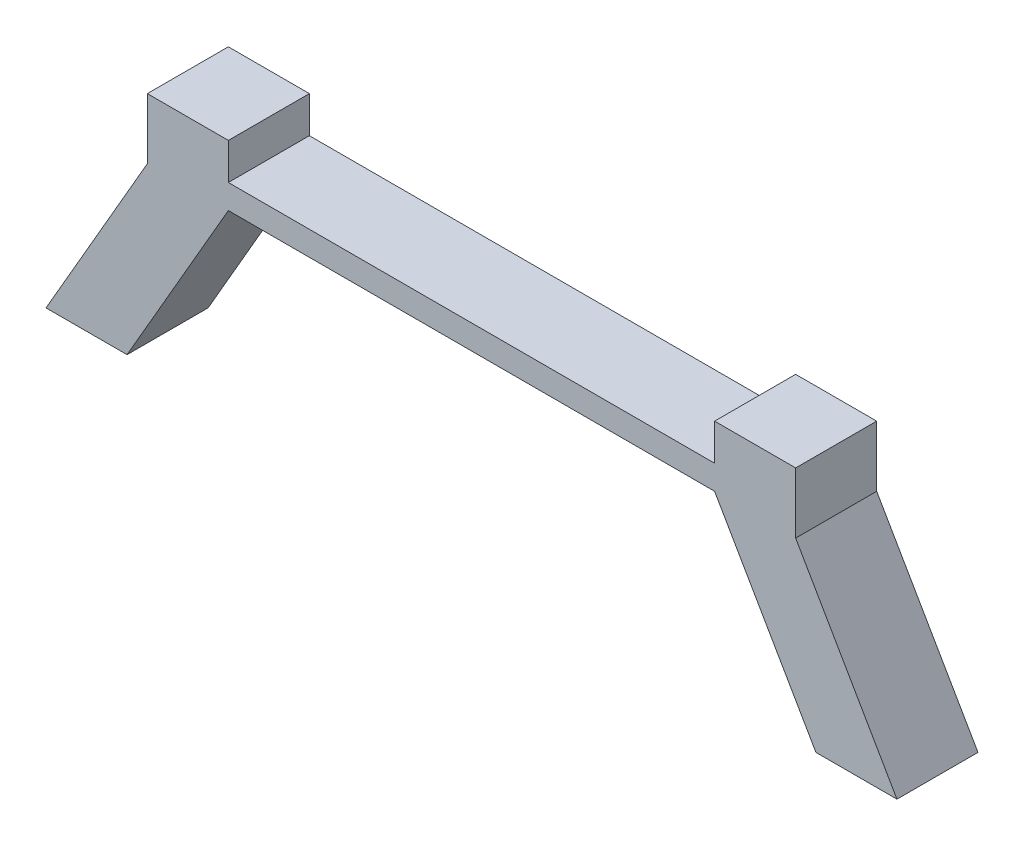
ISO-10303-21;
HEADER;
FILE_DESCRIPTION(('STEP AP214'),'2;1');
FILE_NAME('part.step','',(''),(''),'','','');
FILE_SCHEMA(('AUTOMOTIVE_DESIGN { 1 0 10303 214 1 1 1 1 }'));
ENDSEC;
DATA;
#1=APPLICATION_CONTEXT('core data for automotive mechanical design processes');
#2=APPLICATION_PROTOCOL_DEFINITION('international standard','automotive_design',2000,#1);
#3=PRODUCT_CONTEXT('',#1,'mechanical');
#4=PRODUCT('Part','Part','',(#3));
#5=PRODUCT_RELATED_PRODUCT_CATEGORY('part','',(#4));
#6=PRODUCT_DEFINITION_FORMATION('','',#4);
#7=PRODUCT_DEFINITION_CONTEXT('part definition',#1,'design');
#8=PRODUCT_DEFINITION('design','',#6,#7);
#9=PRODUCT_DEFINITION_SHAPE('','',#8);
#10=(LENGTH_UNIT() NAMED_UNIT(*) SI_UNIT(.MILLI.,.METRE.));
#11=(NAMED_UNIT(*) PLANE_ANGLE_UNIT() SI_UNIT($,.RADIAN.));
#12=(NAMED_UNIT(*) SI_UNIT($,.STERADIAN.) SOLID_ANGLE_UNIT());
#13=UNCERTAINTY_MEASURE_WITH_UNIT(LENGTH_MEASURE(1.E-05),#10,'distance_accuracy_value','');
#14=(GEOMETRIC_REPRESENTATION_CONTEXT(3) GLOBAL_UNCERTAINTY_ASSIGNED_CONTEXT((#13)) GLOBAL_UNIT_ASSIGNED_CONTEXT((#10,
#11,#12)) REPRESENTATION_CONTEXT('',''));
#15=CARTESIAN_POINT('',(0.,0.,0.));
#16=DIRECTION('',(0.,0.,1.));
#17=DIRECTION('',(1.,0.,0.));
#18=AXIS2_PLACEMENT_3D('',#15,#16,#17);
#19=CARTESIAN_POINT('',(0.,0.,0.));
#20=DIRECTION('',(0.,1.,0.));
#21=DIRECTION('',(0.,0.,1.));
#22=AXIS2_PLACEMENT_3D('',#19,#20,#21);
#23=PLANE('',#22);
#24=DIRECTION('',(0.,0.,1.));
#25=VECTOR('',#24,1.);
#26=CARTESIAN_POINT('',(19.9999999999999,0.,-82.4499799839841));
#27=LINE('',#26,#25);
#28=CARTESIAN_POINT('',(19.9999999999999,0.,-20.));
#29=VERTEX_POINT('',#28);
#30=CARTESIAN_POINT('',(19.9999999999999,0.,0.));
#31=VERTEX_POINT('',#30);
#32=EDGE_CURVE('E92',#29,#31,#27,.T.);
#33=ORIENTED_EDGE('',*,*,#32,.F.);
#34=DIRECTION('',(1.,0.,0.));
#35=VECTOR('',#34,1.);
#36=CARTESIAN_POINT('',(0.,0.,-20.));
#37=LINE('',#36,#35);
#38=CARTESIAN_POINT('',(140.,2.78856798763272E-13,-20.));
#39=VERTEX_POINT('',#38);
#40=EDGE_CURVE('E266',#29,#39,#37,.T.);
#41=ORIENTED_EDGE('',*,*,#40,.T.);
#42=DIRECTION('',(0.,0.,1.));
#43=VECTOR('',#42,1.);
#44=CARTESIAN_POINT('',(140.,2.78856798763272E-13,-82.4499799839841));
#45=LINE('',#44,#43);
#46=CARTESIAN_POINT('',(140.,0.,0.));
#47=VERTEX_POINT('',#46);
#48=EDGE_CURVE('E222',#39,#47,#45,.T.);
#49=ORIENTED_EDGE('',*,*,#48,.T.);
#50=DIRECTION('',(1.,0.,0.));
#51=VECTOR('',#50,1.);
#52=CARTESIAN_POINT('',(0.,0.,0.));
#53=LINE('',#52,#51);
#54=EDGE_CURVE('E308',#31,#47,#53,.T.);
#55=ORIENTED_EDGE('',*,*,#54,.F.);
#56=EDGE_LOOP('',(#33,#41,#49,#55));
#57=FACE_BOUND('',#56,.T.);
#58=ADVANCED_FACE('F68',(#57),#23,.F.);
#59=CARTESIAN_POINT('',(0.,15.,0.));
#60=DIRECTION('',(0.,1.,0.));
#61=DIRECTION('',(0.,0.,1.));
#62=AXIS2_PLACEMENT_3D('',#59,#60,#61);
#63=PLANE('',#62);
#64=DIRECTION('',(1.,0.,0.));
#65=VECTOR('',#64,1.);
#66=CARTESIAN_POINT('',(0.,15.,0.));
#67=LINE('',#66,#65);
#68=CARTESIAN_POINT('',(0.,15.,0.));
#69=VERTEX_POINT('',#68);
#70=CARTESIAN_POINT('',(20.,15.,0.));
#71=VERTEX_POINT('',#70);
#72=EDGE_CURVE('E295',#69,#71,#67,.T.);
#73=ORIENTED_EDGE('',*,*,#72,.T.);
#74=DIRECTION('',(0.,0.,-1.));
#75=VECTOR('',#74,1.);
#76=CARTESIAN_POINT('',(20.,15.,0.));
#77=LINE('',#76,#75);
#78=CARTESIAN_POINT('',(20.,15.,-20.));
#79=VERTEX_POINT('',#78);
#80=EDGE_CURVE('E253',#71,#79,#77,.T.);
#81=ORIENTED_EDGE('',*,*,#80,.T.);
#82=DIRECTION('',(1.,0.,0.));
#83=VECTOR('',#82,1.);
#84=CARTESIAN_POINT('',(0.,15.,-20.));
#85=LINE('',#84,#83);
#86=CARTESIAN_POINT('',(0.,15.,-20.));
#87=VERTEX_POINT('',#86);
#88=EDGE_CURVE('E285',#87,#79,#85,.T.);
#89=ORIENTED_EDGE('',*,*,#88,.F.);
#90=DIRECTION('',(0.,0.,-1.));
#91=VECTOR('',#90,1.);
#92=CARTESIAN_POINT('',(0.,15.,0.));
#93=LINE('',#92,#91);
#94=EDGE_CURVE('E296',#69,#87,#93,.T.);
#95=ORIENTED_EDGE('',*,*,#94,.F.);
#96=EDGE_LOOP('',(#73,#81,#89,#95));
#97=FACE_BOUND('',#96,.T.);
#98=ADVANCED_FACE('F337',(#97),#63,.T.);
#99=CARTESIAN_POINT('',(0.,15.,-20.));
#100=DIRECTION('',(0.,0.,-1.));
#101=DIRECTION('',(-1.,0.,0.));
#102=AXIS2_PLACEMENT_3D('',#99,#100,#101);
#103=PLANE('',#102);
#104=DIRECTION('',(-1.,0.,0.));
#105=VECTOR('',#104,1.);
#106=CARTESIAN_POINT('',(0.,6.,-20.));
#107=LINE('',#106,#105);
#108=CARTESIAN_POINT('',(140.,6.,-20.));
#109=VERTEX_POINT('',#108);
#110=CARTESIAN_POINT('',(20.,6.,-20.));
#111=VERTEX_POINT('',#110);
#112=EDGE_CURVE('E255',#109,#111,#107,.T.);
#113=ORIENTED_EDGE('',*,*,#112,.F.);
#114=DIRECTION('',(0.,1.,0.));
#115=VECTOR('',#114,1.);
#116=CARTESIAN_POINT('',(140.,6.,-20.));
#117=LINE('',#116,#115);
#118=CARTESIAN_POINT('',(140.,15.,-20.));
#119=VERTEX_POINT('',#118);
#120=EDGE_CURVE('E273',#109,#119,#117,.T.);
#121=ORIENTED_EDGE('',*,*,#120,.T.);
#122=CARTESIAN_POINT('',(160.,15.,-20.));
#123=VERTEX_POINT('',#122);
#124=EDGE_CURVE('E286',#119,#123,#85,.T.);
#125=ORIENTED_EDGE('',*,*,#124,.T.);
#126=DIRECTION('',(0.,-1.,0.));
#127=VECTOR('',#126,1.);
#128=CARTESIAN_POINT('',(160.,15.,-20.));
#129=LINE('',#128,#127);
#130=CARTESIAN_POINT('',(160.,3.70074341541719E-13,-20.));
#131=VERTEX_POINT('',#130);
#132=EDGE_CURVE('E71',#123,#131,#129,.T.);
#133=ORIENTED_EDGE('',*,*,#132,.T.);
#134=DIRECTION('',(-0.500000000000004,0.866025403784437,0.));
#135=VECTOR('',#134,1.);
#136=CARTESIAN_POINT('',(160.,3.69487969562839E-13,-20.));
#137=LINE('',#136,#135);
#138=CARTESIAN_POINT('',(185.,-43.3012701892215,-20.));
#139=VERTEX_POINT('',#138);
#140=EDGE_CURVE('E221',#139,#131,#137,.T.);
#141=ORIENTED_EDGE('',*,*,#140,.F.);
#142=DIRECTION('',(1.,0.,0.));
#143=VECTOR('',#142,1.);
#144=CARTESIAN_POINT('',(185.,-43.3012701892215,-20.));
#145=LINE('',#144,#143);
#146=CARTESIAN_POINT('',(165.,-43.3012701892216,-20.));
#147=VERTEX_POINT('',#146);
#148=EDGE_CURVE('E219',#147,#139,#145,.T.);
#149=ORIENTED_EDGE('',*,*,#148,.F.);
#150=DIRECTION('',(0.500000000000002,-0.866025403784438,0.));
#151=VECTOR('',#150,1.);
#152=CARTESIAN_POINT('',(165.,-43.3012701892216,-20.));
#153=LINE('',#152,#151);
#154=EDGE_CURVE('E223',#39,#147,#153,.T.);
#155=ORIENTED_EDGE('',*,*,#154,.F.);
#156=ORIENTED_EDGE('',*,*,#40,.F.);
#157=DIRECTION('',(0.499999999999998,0.86602540378444,0.));
#158=VECTOR('',#157,1.);
#159=CARTESIAN_POINT('',(-5.,-43.301270189222,-20.));
#160=LINE('',#159,#158);
#161=CARTESIAN_POINT('',(-5.,-43.301270189222,-20.));
#162=VERTEX_POINT('',#161);
#163=EDGE_CURVE('E182',#162,#29,#160,.T.);
#164=ORIENTED_EDGE('',*,*,#163,.F.);
#165=DIRECTION('',(1.,0.,0.));
#166=VECTOR('',#165,1.);
#167=CARTESIAN_POINT('',(-25.,-43.301270189222,-20.));
#168=LINE('',#167,#166);
#169=CARTESIAN_POINT('',(-25.,-43.301270189222,-20.));
#170=VERTEX_POINT('',#169);
#171=EDGE_CURVE('E173',#170,#162,#168,.T.);
#172=ORIENTED_EDGE('',*,*,#171,.F.);
#173=DIRECTION('',(-0.5,-0.866025403784439,0.));
#174=VECTOR('',#173,1.);
#175=CARTESIAN_POINT('',(0.,0.,-20.));
#176=LINE('',#175,#174);
#177=CARTESIAN_POINT('',(0.,0.,-20.));
#178=VERTEX_POINT('',#177);
#179=EDGE_CURVE('E180',#178,#170,#176,.T.);
#180=ORIENTED_EDGE('',*,*,#179,.F.);
#181=DIRECTION('',(0.,-1.,0.));
#182=VECTOR('',#181,1.);
#183=CARTESIAN_POINT('',(0.,15.,-20.));
#184=LINE('',#183,#182);
#185=EDGE_CURVE('E12',#87,#178,#184,.T.);
#186=ORIENTED_EDGE('',*,*,#185,.F.);
#187=ORIENTED_EDGE('',*,*,#88,.T.);
#188=DIRECTION('',(0.,1.,0.));
#189=VECTOR('',#188,1.);
#190=CARTESIAN_POINT('',(20.,6.,-20.));
#191=LINE('',#190,#189);
#192=EDGE_CURVE('E263',#111,#79,#191,.T.);
#193=ORIENTED_EDGE('',*,*,#192,.F.);
#194=EDGE_LOOP('',(#113,#121,#125,#133,#141,#149,#155,#156,#164,#172,#180,#186,#187,#193));
#195=FACE_BOUND('',#194,.T.);
#196=ADVANCED_FACE('F72',(#195),#103,.T.);
#197=CARTESIAN_POINT('',(0.,15.,0.));
#198=DIRECTION('',(-1.,0.,0.));
#199=DIRECTION('',(0.,0.,1.));
#200=AXIS2_PLACEMENT_3D('',#197,#198,#199);
#201=PLANE('',#200);
#202=DIRECTION('',(0.,0.,-1.));
#203=VECTOR('',#202,1.);
#204=CARTESIAN_POINT('',(0.,0.,0.));
#205=LINE('',#204,#203);
#206=CARTESIAN_POINT('',(0.,0.,0.));
#207=VERTEX_POINT('',#206);
#208=EDGE_CURVE('E200',#207,#178,#205,.T.);
#209=ORIENTED_EDGE('',*,*,#208,.F.);
#210=DIRECTION('',(0.,-1.,0.));
#211=VECTOR('',#210,1.);
#212=CARTESIAN_POINT('',(0.,15.,0.));
#213=LINE('',#212,#211);
#214=EDGE_CURVE('E78',#69,#207,#213,.T.);
#215=ORIENTED_EDGE('',*,*,#214,.F.);
#216=ORIENTED_EDGE('',*,*,#94,.T.);
#217=ORIENTED_EDGE('',*,*,#185,.T.);
#218=EDGE_LOOP('',(#209,#215,#216,#217));
#219=FACE_BOUND('',#218,.T.);
#220=ADVANCED_FACE('F348',(#219),#201,.T.);
#221=CARTESIAN_POINT('',(0.,15.,0.));
#222=DIRECTION('',(0.,0.,-1.));
#223=DIRECTION('',(-1.,0.,0.));
#224=AXIS2_PLACEMENT_3D('',#221,#222,#223);
#225=PLANE('',#224);
#226=DIRECTION('',(1.,0.,0.));
#227=VECTOR('',#226,1.);
#228=CARTESIAN_POINT('',(0.,6.,0.));
#229=LINE('',#228,#227);
#230=CARTESIAN_POINT('',(20.,6.,0.));
#231=VERTEX_POINT('',#230);
#232=CARTESIAN_POINT('',(140.,6.,0.));
#233=VERTEX_POINT('',#232);
#234=EDGE_CURVE('E247',#231,#233,#229,.T.);
#235=ORIENTED_EDGE('',*,*,#234,.F.);
#236=DIRECTION('',(0.,1.,0.));
#237=VECTOR('',#236,1.);
#238=CARTESIAN_POINT('',(20.,6.,0.));
#239=LINE('',#238,#237);
#240=EDGE_CURVE('E256',#231,#71,#239,.T.);
#241=ORIENTED_EDGE('',*,*,#240,.T.);
#242=ORIENTED_EDGE('',*,*,#72,.F.);
#243=ORIENTED_EDGE('',*,*,#214,.T.);
#244=DIRECTION('',(-0.499999999999999,-0.866025403784439,0.));
#245=VECTOR('',#244,1.);
#246=CARTESIAN_POINT('',(0.,0.,0.));
#247=LINE('',#246,#245);
#248=CARTESIAN_POINT('',(-25.,-43.301270189222,0.));
#249=VERTEX_POINT('',#248);
#250=EDGE_CURVE('E208',#207,#249,#247,.T.);
#251=ORIENTED_EDGE('',*,*,#250,.T.);
#252=DIRECTION('',(1.,0.,0.));
#253=VECTOR('',#252,1.);
#254=CARTESIAN_POINT('',(-25.,-43.301270189222,0.));
#255=LINE('',#254,#253);
#256=CARTESIAN_POINT('',(-5.,-43.301270189222,0.));
#257=VERTEX_POINT('',#256);
#258=EDGE_CURVE('E194',#249,#257,#255,.T.);
#259=ORIENTED_EDGE('',*,*,#258,.T.);
#260=DIRECTION('',(0.499999999999998,0.86602540378444,0.));
#261=VECTOR('',#260,1.);
#262=CARTESIAN_POINT('',(-5.,-43.301270189222,0.));
#263=LINE('',#262,#261);
#264=EDGE_CURVE('E203',#257,#31,#263,.T.);
#265=ORIENTED_EDGE('',*,*,#264,.T.);
#266=ORIENTED_EDGE('',*,*,#54,.T.);
#267=DIRECTION('',(0.500000000000002,-0.866025403784437,0.));
#268=VECTOR('',#267,1.);
#269=CARTESIAN_POINT('',(165.,-43.3012701892216,0.));
#270=LINE('',#269,#268);
#271=CARTESIAN_POINT('',(165.,-43.3012701892216,0.));
#272=VERTEX_POINT('',#271);
#273=EDGE_CURVE('E87',#47,#272,#270,.T.);
#274=ORIENTED_EDGE('',*,*,#273,.T.);
#275=DIRECTION('',(1.,0.,0.));
#276=VECTOR('',#275,1.);
#277=CARTESIAN_POINT('',(185.,-43.3012701892215,0.));
#278=LINE('',#277,#276);
#279=CARTESIAN_POINT('',(185.,-43.3012701892215,0.));
#280=VERTEX_POINT('',#279);
#281=EDGE_CURVE('E240',#272,#280,#278,.T.);
#282=ORIENTED_EDGE('',*,*,#281,.T.);
#283=DIRECTION('',(-0.500000000000004,0.866025403784437,0.));
#284=VECTOR('',#283,1.);
#285=CARTESIAN_POINT('',(160.,3.70074341541719E-13,0.));
#286=LINE('',#285,#284);
#287=CARTESIAN_POINT('',(160.,3.70074341541719E-13,0.));
#288=VERTEX_POINT('',#287);
#289=EDGE_CURVE('E241',#280,#288,#286,.T.);
#290=ORIENTED_EDGE('',*,*,#289,.T.);
#291=DIRECTION('',(0.,-1.,0.));
#292=VECTOR('',#291,1.);
#293=CARTESIAN_POINT('',(160.,15.,0.));
#294=LINE('',#293,#292);
#295=CARTESIAN_POINT('',(160.,15.,0.));
#296=VERTEX_POINT('',#295);
#297=EDGE_CURVE('E311',#296,#288,#294,.T.);
#298=ORIENTED_EDGE('',*,*,#297,.F.);
#299=CARTESIAN_POINT('',(140.,15.,0.));
#300=VERTEX_POINT('',#299);
#301=EDGE_CURVE('E292',#300,#296,#67,.T.);
#302=ORIENTED_EDGE('',*,*,#301,.F.);
#303=DIRECTION('',(0.,1.,0.));
#304=VECTOR('',#303,1.);
#305=CARTESIAN_POINT('',(140.,6.,0.));
#306=LINE('',#305,#304);
#307=EDGE_CURVE('E265',#233,#300,#306,.T.);
#308=ORIENTED_EDGE('',*,*,#307,.F.);
#309=EDGE_LOOP('',(#235,#241,#242,#243,#251,#259,#265,#266,#274,#282,#290,#298,#302,#308));
#310=FACE_BOUND('',#309,.T.);
#311=ADVANCED_FACE('F329',(#310),#225,.F.);
#312=CARTESIAN_POINT('',(160.,15.,0.));
#313=DIRECTION('',(-1.,0.,0.));
#314=DIRECTION('',(0.,0.,1.));
#315=AXIS2_PLACEMENT_3D('',#312,#313,#314);
#316=PLANE('',#315);
#317=DIRECTION('',(0.,0.,-1.));
#318=VECTOR('',#317,1.);
#319=CARTESIAN_POINT('',(160.,0.,0.));
#320=LINE('',#319,#318);
#321=EDGE_CURVE('E301',#288,#131,#320,.T.);
#322=ORIENTED_EDGE('',*,*,#321,.T.);
#323=ORIENTED_EDGE('',*,*,#132,.F.);
#324=DIRECTION('',(0.,0.,-1.));
#325=VECTOR('',#324,1.);
#326=CARTESIAN_POINT('',(160.,15.,0.));
#327=LINE('',#326,#325);
#328=EDGE_CURVE('E289',#296,#123,#327,.T.);
#329=ORIENTED_EDGE('',*,*,#328,.F.);
#330=ORIENTED_EDGE('',*,*,#297,.T.);
#331=EDGE_LOOP('',(#322,#323,#329,#330));
#332=FACE_BOUND('',#331,.T.);
#333=ADVANCED_FACE('F323',(#332),#316,.F.);
#334=DIRECTION('',(0.,0.,-1.));
#335=VECTOR('',#334,1.);
#336=CARTESIAN_POINT('',(140.,15.,0.));
#337=LINE('',#336,#335);
#338=EDGE_CURVE('E212',#300,#119,#337,.T.);
#339=ORIENTED_EDGE('',*,*,#338,.F.);
#340=ORIENTED_EDGE('',*,*,#301,.T.);
#341=ORIENTED_EDGE('',*,*,#328,.T.);
#342=ORIENTED_EDGE('',*,*,#124,.F.);
#343=EDGE_LOOP('',(#339,#340,#341,#342));
#344=FACE_BOUND('',#343,.T.);
#345=ADVANCED_FACE('F350',(#344),#63,.T.);
#346=CARTESIAN_POINT('',(20.,6.,0.));
#347=DIRECTION('',(1.,0.,0.));
#348=DIRECTION('',(0.,0.,-1.));
#349=AXIS2_PLACEMENT_3D('',#346,#347,#348);
#350=PLANE('',#349);
#351=ORIENTED_EDGE('',*,*,#80,.F.);
#352=ORIENTED_EDGE('',*,*,#240,.F.);
#353=DIRECTION('',(0.,0.,-1.));
#354=VECTOR('',#353,1.);
#355=CARTESIAN_POINT('',(20.,6.,0.));
#356=LINE('',#355,#354);
#357=EDGE_CURVE('E246',#231,#111,#356,.T.);
#358=ORIENTED_EDGE('',*,*,#357,.T.);
#359=ORIENTED_EDGE('',*,*,#192,.T.);
#360=EDGE_LOOP('',(#351,#352,#358,#359));
#361=FACE_BOUND('',#360,.T.);
#362=ADVANCED_FACE('F357',(#361),#350,.T.);
#363=CARTESIAN_POINT('',(0.,6.,0.));
#364=DIRECTION('',(0.,1.,0.));
#365=DIRECTION('',(0.,0.,1.));
#366=AXIS2_PLACEMENT_3D('',#363,#364,#365);
#367=PLANE('',#366);
#368=ORIENTED_EDGE('',*,*,#357,.F.);
#369=ORIENTED_EDGE('',*,*,#234,.T.);
#370=DIRECTION('',(0.,0.,-1.));
#371=VECTOR('',#370,1.);
#372=CARTESIAN_POINT('',(140.,6.,0.));
#373=LINE('',#372,#371);
#374=EDGE_CURVE('E269',#233,#109,#373,.T.);
#375=ORIENTED_EDGE('',*,*,#374,.T.);
#376=ORIENTED_EDGE('',*,*,#112,.T.);
#377=EDGE_LOOP('',(#368,#369,#375,#376));
#378=FACE_BOUND('',#377,.T.);
#379=ADVANCED_FACE('F364',(#378),#367,.T.);
#380=CARTESIAN_POINT('',(140.,6.,0.));
#381=DIRECTION('',(1.,0.,0.));
#382=DIRECTION('',(0.,0.,-1.));
#383=AXIS2_PLACEMENT_3D('',#380,#381,#382);
#384=PLANE('',#383);
#385=ORIENTED_EDGE('',*,*,#338,.T.);
#386=ORIENTED_EDGE('',*,*,#120,.F.);
#387=ORIENTED_EDGE('',*,*,#374,.F.);
#388=ORIENTED_EDGE('',*,*,#307,.T.);
#389=EDGE_LOOP('',(#385,#386,#387,#388));
#390=FACE_BOUND('',#389,.T.);
#391=ADVANCED_FACE('F372',(#390),#384,.F.);
#392=CARTESIAN_POINT('',(160.,3.70074341541719E-13,-82.4499799839841));
#393=DIRECTION('',(0.866025403784437,0.500000000000004,0.));
#394=DIRECTION('',(-0.500000000000004,0.866025403784437,0.));
#395=AXIS2_PLACEMENT_3D('',#392,#393,#394);
#396=PLANE('',#395);
#397=DIRECTION('',(0.,0.,1.));
#398=VECTOR('',#397,1.);
#399=CARTESIAN_POINT('',(185.,-43.3012701892215,-82.4499799839841));
#400=LINE('',#399,#398);
#401=EDGE_CURVE('E220',#139,#280,#400,.T.);
#402=ORIENTED_EDGE('',*,*,#401,.F.);
#403=ORIENTED_EDGE('',*,*,#140,.T.);
#404=ORIENTED_EDGE('',*,*,#321,.F.);
#405=ORIENTED_EDGE('',*,*,#289,.F.);
#406=EDGE_LOOP('',(#402,#403,#404,#405));
#407=FACE_BOUND('',#406,.T.);
#408=ADVANCED_FACE('F330',(#407),#396,.T.);
#409=CARTESIAN_POINT('',(165.,-43.3012701892216,-82.4499799839841));
#410=DIRECTION('',(-0.866025403784437,-0.500000000000002,0.));
#411=DIRECTION('',(0.500000000000002,-0.866025403784438,0.));
#412=AXIS2_PLACEMENT_3D('',#409,#410,#411);
#413=PLANE('',#412);
#414=ORIENTED_EDGE('',*,*,#48,.F.);
#415=ORIENTED_EDGE('',*,*,#154,.T.);
#416=DIRECTION('',(0.,0.,1.));
#417=VECTOR('',#416,1.);
#418=CARTESIAN_POINT('',(165.,-43.3012701892216,-82.4499799839841));
#419=LINE('',#418,#417);
#420=EDGE_CURVE('E226',#147,#272,#419,.T.);
#421=ORIENTED_EDGE('',*,*,#420,.T.);
#422=ORIENTED_EDGE('',*,*,#273,.F.);
#423=EDGE_LOOP('',(#414,#415,#421,#422));
#424=FACE_BOUND('',#423,.T.);
#425=ADVANCED_FACE('F336',(#424),#413,.T.);
#426=CARTESIAN_POINT('',(185.,-43.3012701892215,-82.4499799839841));
#427=DIRECTION('',(0.,-1.,0.));
#428=DIRECTION('',(1.,0.,0.));
#429=AXIS2_PLACEMENT_3D('',#426,#427,#428);
#430=PLANE('',#429);
#431=ORIENTED_EDGE('',*,*,#420,.F.);
#432=ORIENTED_EDGE('',*,*,#148,.T.);
#433=ORIENTED_EDGE('',*,*,#401,.T.);
#434=ORIENTED_EDGE('',*,*,#281,.F.);
#435=EDGE_LOOP('',(#431,#432,#433,#434));
#436=FACE_BOUND('',#435,.T.);
#437=ADVANCED_FACE('F333',(#436),#430,.T.);
#438=CARTESIAN_POINT('',(0.,0.,-82.4499799839841));
#439=DIRECTION('',(-0.866025403784439,0.499999999999999,0.));
#440=DIRECTION('',(-0.5,-0.866025403784439,0.));
#441=AXIS2_PLACEMENT_3D('',#438,#439,#440);
#442=PLANE('',#441);
#443=ORIENTED_EDGE('',*,*,#208,.T.);
#444=ORIENTED_EDGE('',*,*,#179,.T.);
#445=DIRECTION('',(0.,0.,1.));
#446=VECTOR('',#445,1.);
#447=CARTESIAN_POINT('',(-25.,-43.301270189222,-82.4499799839841));
#448=LINE('',#447,#446);
#449=EDGE_CURVE('E186',#170,#249,#448,.T.);
#450=ORIENTED_EDGE('',*,*,#449,.T.);
#451=ORIENTED_EDGE('',*,*,#250,.F.);
#452=EDGE_LOOP('',(#443,#444,#450,#451));
#453=FACE_BOUND('',#452,.T.);
#454=ADVANCED_FACE('F197',(#453),#442,.T.);
#455=CARTESIAN_POINT('',(-25.,-43.301270189222,-82.4499799839841));
#456=DIRECTION('',(0.,-1.,0.));
#457=DIRECTION('',(1.,0.,0.));
#458=AXIS2_PLACEMENT_3D('',#455,#456,#457);
#459=PLANE('',#458);
#460=ORIENTED_EDGE('',*,*,#449,.F.);
#461=ORIENTED_EDGE('',*,*,#171,.T.);
#462=DIRECTION('',(0.,0.,1.));
#463=VECTOR('',#462,1.);
#464=CARTESIAN_POINT('',(-5.,-43.301270189222,-82.4499799839841));
#465=LINE('',#464,#463);
#466=EDGE_CURVE('E183',#162,#257,#465,.T.);
#467=ORIENTED_EDGE('',*,*,#466,.T.);
#468=ORIENTED_EDGE('',*,*,#258,.F.);
#469=EDGE_LOOP('',(#460,#461,#467,#468));
#470=FACE_BOUND('',#469,.T.);
#471=ADVANCED_FACE('F188',(#470),#459,.T.);
#472=CARTESIAN_POINT('',(-5.,-43.301270189222,-82.4499799839841));
#473=DIRECTION('',(0.86602540378444,-0.499999999999998,0.));
#474=DIRECTION('',(0.499999999999998,0.86602540378444,0.));
#475=AXIS2_PLACEMENT_3D('',#472,#473,#474);
#476=PLANE('',#475);
#477=ORIENTED_EDGE('',*,*,#466,.F.);
#478=ORIENTED_EDGE('',*,*,#163,.T.);
#479=ORIENTED_EDGE('',*,*,#32,.T.);
#480=ORIENTED_EDGE('',*,*,#264,.F.);
#481=EDGE_LOOP('',(#477,#478,#479,#480));
#482=FACE_BOUND('',#481,.T.);
#483=ADVANCED_FACE('F384',(#482),#476,.T.);
#484=CLOSED_SHELL('',(#58,#98,#196,#220,#311,#333,#345,#362,#379,#391,#408,#425,#437,#454,#471,#483));
#485=MANIFOLD_SOLID_BREP('B2',#484);
#486=ADVANCED_BREP_SHAPE_REPRESENTATION('',(#18,#485),#14);
#487=SHAPE_DEFINITION_REPRESENTATION(#9,#486);
ENDSEC;
END-ISO-10303-21;
